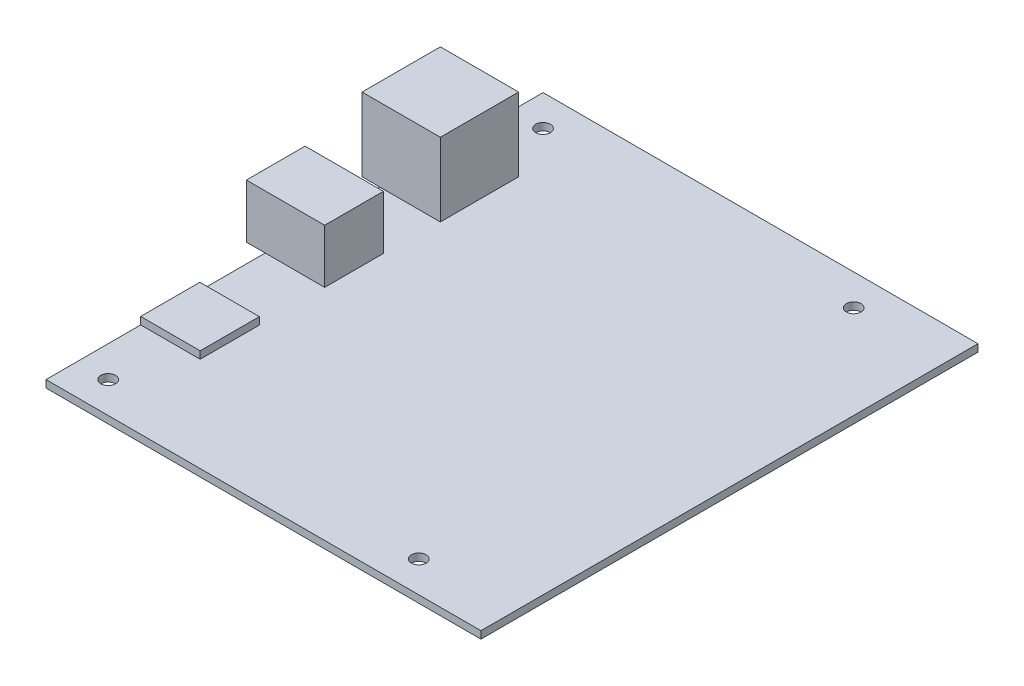
ISO-10303-21;
HEADER;
FILE_DESCRIPTION(('STEP AP214'),'2;1');
FILE_NAME('part.step','',(''),(''),'','','');
FILE_SCHEMA(('AUTOMOTIVE_DESIGN { 1 0 10303 214 1 1 1 1 }'));
ENDSEC;
DATA;
#1=APPLICATION_CONTEXT('core data for automotive mechanical design processes');
#2=APPLICATION_PROTOCOL_DEFINITION('international standard','automotive_design',2000,#1);
#3=PRODUCT_CONTEXT('',#1,'mechanical');
#4=PRODUCT('Part','Part','',(#3));
#5=PRODUCT_RELATED_PRODUCT_CATEGORY('part','',(#4));
#6=PRODUCT_DEFINITION_FORMATION('','',#4);
#7=PRODUCT_DEFINITION_CONTEXT('part definition',#1,'design');
#8=PRODUCT_DEFINITION('design','',#6,#7);
#9=PRODUCT_DEFINITION_SHAPE('','',#8);
#10=(LENGTH_UNIT() NAMED_UNIT(*) SI_UNIT(.MILLI.,.METRE.));
#11=(NAMED_UNIT(*) PLANE_ANGLE_UNIT() SI_UNIT($,.RADIAN.));
#12=(NAMED_UNIT(*) SI_UNIT($,.STERADIAN.) SOLID_ANGLE_UNIT());
#13=UNCERTAINTY_MEASURE_WITH_UNIT(LENGTH_MEASURE(1.E-05),#10,'distance_accuracy_value','');
#14=(GEOMETRIC_REPRESENTATION_CONTEXT(3) GLOBAL_UNCERTAINTY_ASSIGNED_CONTEXT((#13)) GLOBAL_UNIT_ASSIGNED_CONTEXT((#10,
#11,#12)) REPRESENTATION_CONTEXT('',''));
#15=CARTESIAN_POINT('',(0.,0.,0.));
#16=DIRECTION('',(0.,0.,1.));
#17=DIRECTION('',(1.,0.,0.));
#18=AXIS2_PLACEMENT_3D('',#15,#16,#17);
#19=CARTESIAN_POINT('',(44.45,1.5,0.));
#20=DIRECTION('',(1.,0.,0.));
#21=DIRECTION('',(0.,0.,-1.));
#22=AXIS2_PLACEMENT_3D('',#19,#20,#21);
#23=PLANE('',#22);
#24=DIRECTION('',(0.,0.,1.));
#25=VECTOR('',#24,1.);
#26=CARTESIAN_POINT('',(44.45,0.,0.));
#27=LINE('',#26,#25);
#28=CARTESIAN_POINT('',(44.45,0.,-50.8));
#29=VERTEX_POINT('',#28);
#30=CARTESIAN_POINT('',(44.45,0.,50.8));
#31=VERTEX_POINT('',#30);
#32=EDGE_CURVE('E301',#29,#31,#27,.T.);
#33=ORIENTED_EDGE('',*,*,#32,.F.);
#34=DIRECTION('',(0.,-1.,0.));
#35=VECTOR('',#34,1.);
#36=CARTESIAN_POINT('',(44.45,1.5,-50.8));
#37=LINE('',#36,#35);
#38=CARTESIAN_POINT('',(44.45,1.5,-50.8));
#39=VERTEX_POINT('',#38);
#40=EDGE_CURVE('E318',#39,#29,#37,.T.);
#41=ORIENTED_EDGE('',*,*,#40,.F.);
#42=DIRECTION('',(0.,0.,1.));
#43=VECTOR('',#42,1.);
#44=CARTESIAN_POINT('',(44.45,1.5,0.));
#45=LINE('',#44,#43);
#46=CARTESIAN_POINT('',(44.45,1.5,50.8));
#47=VERTEX_POINT('',#46);
#48=EDGE_CURVE('E276',#39,#47,#45,.T.);
#49=ORIENTED_EDGE('',*,*,#48,.T.);
#50=DIRECTION('',(0.,-1.,0.));
#51=VECTOR('',#50,1.);
#52=CARTESIAN_POINT('',(44.45,1.5,50.8));
#53=LINE('',#52,#51);
#54=EDGE_CURVE('E289',#47,#31,#53,.T.);
#55=ORIENTED_EDGE('',*,*,#54,.T.);
#56=EDGE_LOOP('',(#33,#41,#49,#55));
#57=FACE_BOUND('',#56,.T.);
#58=ADVANCED_FACE('F38',(#57),#23,.T.);
#59=CARTESIAN_POINT('',(0.,1.5,-50.8));
#60=DIRECTION('',(0.,0.,-1.));
#61=DIRECTION('',(-1.,0.,0.));
#62=AXIS2_PLACEMENT_3D('',#59,#60,#61);
#63=PLANE('',#62);
#64=DIRECTION('',(1.,0.,0.));
#65=VECTOR('',#64,1.);
#66=CARTESIAN_POINT('',(0.,0.,-50.8));
#67=LINE('',#66,#65);
#68=CARTESIAN_POINT('',(-44.45,0.,-50.8));
#69=VERTEX_POINT('',#68);
#70=EDGE_CURVE('E304',#69,#29,#67,.T.);
#71=ORIENTED_EDGE('',*,*,#70,.F.);
#72=DIRECTION('',(0.,-1.,0.));
#73=VECTOR('',#72,1.);
#74=CARTESIAN_POINT('',(-44.45,1.5,-50.8));
#75=LINE('',#74,#73);
#76=CARTESIAN_POINT('',(-44.45,1.5,-50.8));
#77=VERTEX_POINT('',#76);
#78=EDGE_CURVE('E316',#77,#69,#75,.T.);
#79=ORIENTED_EDGE('',*,*,#78,.F.);
#80=DIRECTION('',(1.,0.,0.));
#81=VECTOR('',#80,1.);
#82=CARTESIAN_POINT('',(0.,1.5,-50.8));
#83=LINE('',#82,#81);
#84=EDGE_CURVE('E279',#77,#39,#83,.T.);
#85=ORIENTED_EDGE('',*,*,#84,.T.);
#86=ORIENTED_EDGE('',*,*,#40,.T.);
#87=EDGE_LOOP('',(#71,#79,#85,#86));
#88=FACE_BOUND('',#87,.T.);
#89=ADVANCED_FACE('F361',(#88),#63,.T.);
#90=CARTESIAN_POINT('',(-44.45,1.5,0.));
#91=DIRECTION('',(1.,0.,0.));
#92=DIRECTION('',(0.,0.,-1.));
#93=AXIS2_PLACEMENT_3D('',#90,#91,#92);
#94=PLANE('',#93);
#95=DIRECTION('',(0.,0.,1.));
#96=VECTOR('',#95,1.);
#97=CARTESIAN_POINT('',(-44.45,0.,0.));
#98=LINE('',#97,#96);
#99=CARTESIAN_POINT('',(-44.45,0.,50.8));
#100=VERTEX_POINT('',#99);
#101=EDGE_CURVE('E307',#69,#100,#98,.T.);
#102=ORIENTED_EDGE('',*,*,#101,.T.);
#103=DIRECTION('',(0.,-1.,0.));
#104=VECTOR('',#103,1.);
#105=CARTESIAN_POINT('',(-44.45,1.5,50.8));
#106=LINE('',#105,#104);
#107=CARTESIAN_POINT('',(-44.45,1.5,50.8));
#108=VERTEX_POINT('',#107);
#109=EDGE_CURVE('E313',#108,#100,#106,.T.);
#110=ORIENTED_EDGE('',*,*,#109,.F.);
#111=DIRECTION('',(0.,0.,1.));
#112=VECTOR('',#111,1.);
#113=CARTESIAN_POINT('',(-44.45,1.5,0.));
#114=LINE('',#113,#112);
#115=CARTESIAN_POINT('',(-44.45,1.5,31.45));
#116=VERTEX_POINT('',#115);
#117=EDGE_CURVE('E282',#116,#108,#114,.T.);
#118=ORIENTED_EDGE('',*,*,#117,.F.);
#119=DIRECTION('',(0.,-1.,0.));
#120=VECTOR('',#119,1.);
#121=CARTESIAN_POINT('',(-44.45,3.,31.45));
#122=LINE('',#121,#120);
#123=CARTESIAN_POINT('',(-44.45,3.,31.45));
#124=VERTEX_POINT('',#123);
#125=EDGE_CURVE('E53',#124,#116,#122,.T.);
#126=ORIENTED_EDGE('',*,*,#125,.F.);
#127=DIRECTION('',(0.,0.,1.));
#128=VECTOR('',#127,1.);
#129=CARTESIAN_POINT('',(-44.45,3.,0.));
#130=LINE('',#129,#128);
#131=CARTESIAN_POINT('',(-44.45,3.,19.35));
#132=VERTEX_POINT('',#131);
#133=EDGE_CURVE('E188',#132,#124,#130,.T.);
#134=ORIENTED_EDGE('',*,*,#133,.F.);
#135=DIRECTION('',(0.,-1.,0.));
#136=VECTOR('',#135,1.);
#137=CARTESIAN_POINT('',(-44.45,3.,19.35));
#138=LINE('',#137,#136);
#139=CARTESIAN_POINT('',(-44.45,1.5,19.35));
#140=VERTEX_POINT('',#139);
#141=EDGE_CURVE('E176',#132,#140,#138,.T.);
#142=ORIENTED_EDGE('',*,*,#141,.T.);
#143=CARTESIAN_POINT('',(-44.45,1.5,5.99999999999998));
#144=VERTEX_POINT('',#143);
#145=EDGE_CURVE('E347',#144,#140,#114,.T.);
#146=ORIENTED_EDGE('',*,*,#145,.F.);
#147=CARTESIAN_POINT('',(-44.45,1.5,-6.00000000000002));
#148=VERTEX_POINT('',#147);
#149=EDGE_CURVE('E345',#148,#144,#114,.T.);
#150=ORIENTED_EDGE('',*,*,#149,.F.);
#151=CARTESIAN_POINT('',(-44.45,1.5,-17.4));
#152=VERTEX_POINT('',#151);
#153=EDGE_CURVE('E344',#152,#148,#114,.T.);
#154=ORIENTED_EDGE('',*,*,#153,.F.);
#155=CARTESIAN_POINT('',(-44.45,1.5,-33.4));
#156=VERTEX_POINT('',#155);
#157=EDGE_CURVE('E287',#156,#152,#114,.T.);
#158=ORIENTED_EDGE('',*,*,#157,.F.);
#159=EDGE_CURVE('E283',#77,#156,#114,.T.);
#160=ORIENTED_EDGE('',*,*,#159,.F.);
#161=ORIENTED_EDGE('',*,*,#78,.T.);
#162=EDGE_LOOP('',(#102,#110,#118,#126,#134,#142,#146,#150,#154,#158,#160,#161));
#163=FACE_BOUND('',#162,.T.);
#164=ADVANCED_FACE('F341',(#163),#94,.F.);
#165=CARTESIAN_POINT('',(-38.1,1.5,-44.45));
#166=DIRECTION('',(0.,-1.,0.));
#167=DIRECTION('',(0.,0.,-1.));
#168=AXIS2_PLACEMENT_3D('',#165,#166,#167);
#169=CYLINDRICAL_SURFACE('',#168,1.5);
#170=CARTESIAN_POINT('',(-38.1,1.5,-44.45));
#171=DIRECTION('',(0.,1.,0.));
#172=DIRECTION('',(0.,0.,1.));
#173=AXIS2_PLACEMENT_3D('',#170,#171,#172);
#174=CIRCLE('',#173,1.5);
#175=CARTESIAN_POINT('',(-38.1,1.5,-42.95));
#176=VERTEX_POINT('',#175);
#177=EDGE_CURVE('E273',#176,#176,#174,.T.);
#178=ORIENTED_EDGE('',*,*,#177,.T.);
#179=EDGE_LOOP('',(#178));
#180=FACE_BOUND('',#179,.T.);
#181=CARTESIAN_POINT('',(-38.1,0.,-44.45));
#182=DIRECTION('',(0.,1.,0.));
#183=DIRECTION('',(0.,0.,1.));
#184=AXIS2_PLACEMENT_3D('',#181,#182,#183);
#185=CIRCLE('',#184,1.5);
#186=CARTESIAN_POINT('',(-38.1,0.,-42.95));
#187=VERTEX_POINT('',#186);
#188=EDGE_CURVE('E298',#187,#187,#185,.T.);
#189=ORIENTED_EDGE('',*,*,#188,.F.);
#190=EDGE_LOOP('',(#189));
#191=FACE_BOUND('',#190,.T.);
#192=ADVANCED_FACE('F372',(#180,#191),#169,.F.);
#193=CARTESIAN_POINT('',(25.4,1.5,-44.45));
#194=DIRECTION('',(0.,-1.,0.));
#195=DIRECTION('',(0.,0.,-1.));
#196=AXIS2_PLACEMENT_3D('',#193,#194,#195);
#197=CYLINDRICAL_SURFACE('',#196,1.5);
#198=CARTESIAN_POINT('',(25.4,1.5,-44.45));
#199=DIRECTION('',(0.,1.,0.));
#200=DIRECTION('',(0.,0.,1.));
#201=AXIS2_PLACEMENT_3D('',#198,#199,#200);
#202=CIRCLE('',#201,1.5);
#203=CARTESIAN_POINT('',(25.4,1.5,-42.95));
#204=VERTEX_POINT('',#203);
#205=EDGE_CURVE('E270',#204,#204,#202,.T.);
#206=ORIENTED_EDGE('',*,*,#205,.T.);
#207=EDGE_LOOP('',(#206));
#208=FACE_BOUND('',#207,.T.);
#209=CARTESIAN_POINT('',(25.4,0.,-44.45));
#210=DIRECTION('',(0.,1.,0.));
#211=DIRECTION('',(0.,0.,1.));
#212=AXIS2_PLACEMENT_3D('',#209,#210,#211);
#213=CIRCLE('',#212,1.5);
#214=CARTESIAN_POINT('',(25.4,0.,-42.95));
#215=VERTEX_POINT('',#214);
#216=EDGE_CURVE('E295',#215,#215,#213,.T.);
#217=ORIENTED_EDGE('',*,*,#216,.F.);
#218=EDGE_LOOP('',(#217));
#219=FACE_BOUND('',#218,.T.);
#220=ADVANCED_FACE('F375',(#208,#219),#197,.F.);
#221=CARTESIAN_POINT('',(-38.1,1.5,44.45));
#222=DIRECTION('',(0.,-1.,0.));
#223=DIRECTION('',(0.,0.,-1.));
#224=AXIS2_PLACEMENT_3D('',#221,#222,#223);
#225=CYLINDRICAL_SURFACE('',#224,1.5);
#226=CARTESIAN_POINT('',(-38.1,1.5,44.45));
#227=DIRECTION('',(0.,1.,0.));
#228=DIRECTION('',(0.,0.,1.));
#229=AXIS2_PLACEMENT_3D('',#226,#227,#228);
#230=CIRCLE('',#229,1.5);
#231=CARTESIAN_POINT('',(-38.1,1.5,45.95));
#232=VERTEX_POINT('',#231);
#233=EDGE_CURVE('E266',#232,#232,#230,.T.);
#234=ORIENTED_EDGE('',*,*,#233,.T.);
#235=EDGE_LOOP('',(#234));
#236=FACE_BOUND('',#235,.T.);
#237=CARTESIAN_POINT('',(-38.1,0.,44.45));
#238=DIRECTION('',(0.,1.,0.));
#239=DIRECTION('',(0.,0.,1.));
#240=AXIS2_PLACEMENT_3D('',#237,#238,#239);
#241=CIRCLE('',#240,1.5);
#242=CARTESIAN_POINT('',(-38.1,0.,45.95));
#243=VERTEX_POINT('',#242);
#244=EDGE_CURVE('E292',#243,#243,#241,.T.);
#245=ORIENTED_EDGE('',*,*,#244,.F.);
#246=EDGE_LOOP('',(#245));
#247=FACE_BOUND('',#246,.T.);
#248=ADVANCED_FACE('F378',(#236,#247),#225,.F.);
#249=CARTESIAN_POINT('',(25.4,1.5,44.45));
#250=DIRECTION('',(0.,-1.,0.));
#251=DIRECTION('',(0.,0.,-1.));
#252=AXIS2_PLACEMENT_3D('',#249,#250,#251);
#253=CYLINDRICAL_SURFACE('',#252,1.5);
#254=CARTESIAN_POINT('',(25.4,1.5,44.45));
#255=DIRECTION('',(0.,1.,0.));
#256=DIRECTION('',(0.,0.,1.));
#257=AXIS2_PLACEMENT_3D('',#254,#255,#256);
#258=CIRCLE('',#257,1.5);
#259=CARTESIAN_POINT('',(25.4,1.5,45.95));
#260=VERTEX_POINT('',#259);
#261=EDGE_CURVE('E263',#260,#260,#258,.T.);
#262=ORIENTED_EDGE('',*,*,#261,.T.);
#263=EDGE_LOOP('',(#262));
#264=FACE_BOUND('',#263,.T.);
#265=CARTESIAN_POINT('',(25.4,0.,44.45));
#266=DIRECTION('',(0.,1.,0.));
#267=DIRECTION('',(0.,0.,1.));
#268=AXIS2_PLACEMENT_3D('',#265,#266,#267);
#269=CIRCLE('',#268,1.5);
#270=CARTESIAN_POINT('',(25.4,0.,45.95));
#271=VERTEX_POINT('',#270);
#272=EDGE_CURVE('E262',#271,#271,#269,.T.);
#273=ORIENTED_EDGE('',*,*,#272,.F.);
#274=EDGE_LOOP('',(#273));
#275=FACE_BOUND('',#274,.T.);
#276=ADVANCED_FACE('F40',(#264,#275),#253,.F.);
#277=CARTESIAN_POINT('',(0.,1.5,50.8));
#278=DIRECTION('',(0.,0.,-1.));
#279=DIRECTION('',(-1.,0.,0.));
#280=AXIS2_PLACEMENT_3D('',#277,#278,#279);
#281=PLANE('',#280);
#282=DIRECTION('',(1.,0.,0.));
#283=VECTOR('',#282,1.);
#284=CARTESIAN_POINT('',(0.,0.,50.8));
#285=LINE('',#284,#283);
#286=EDGE_CURVE('E267',#100,#31,#285,.T.);
#287=ORIENTED_EDGE('',*,*,#286,.T.);
#288=ORIENTED_EDGE('',*,*,#54,.F.);
#289=DIRECTION('',(1.,0.,0.));
#290=VECTOR('',#289,1.);
#291=CARTESIAN_POINT('',(0.,1.5,50.8));
#292=LINE('',#291,#290);
#293=EDGE_CURVE('E286',#108,#47,#292,.T.);
#294=ORIENTED_EDGE('',*,*,#293,.F.);
#295=ORIENTED_EDGE('',*,*,#109,.T.);
#296=EDGE_LOOP('',(#287,#288,#294,#295));
#297=FACE_BOUND('',#296,.T.);
#298=ADVANCED_FACE('F355',(#297),#281,.F.);
#299=CARTESIAN_POINT('',(0.,1.5,0.));
#300=DIRECTION('',(0.,1.,0.));
#301=DIRECTION('',(0.,0.,1.));
#302=AXIS2_PLACEMENT_3D('',#299,#300,#301);
#303=PLANE('',#302);
#304=DIRECTION('',(1.,0.,0.));
#305=VECTOR('',#304,1.);
#306=CARTESIAN_POINT('',(0.,1.5,19.35));
#307=LINE('',#306,#305);
#308=CARTESIAN_POINT('',(-32.29,1.5,19.35));
#309=VERTEX_POINT('',#308);
#310=EDGE_CURVE('E195',#140,#309,#307,.T.);
#311=ORIENTED_EDGE('',*,*,#310,.T.);
#312=DIRECTION('',(0.,0.,1.));
#313=VECTOR('',#312,1.);
#314=CARTESIAN_POINT('',(-32.29,1.5,0.));
#315=LINE('',#314,#313);
#316=CARTESIAN_POINT('',(-32.29,1.5,31.45));
#317=VERTEX_POINT('',#316);
#318=EDGE_CURVE('E170',#309,#317,#315,.T.);
#319=ORIENTED_EDGE('',*,*,#318,.T.);
#320=DIRECTION('',(1.,0.,0.));
#321=VECTOR('',#320,1.);
#322=CARTESIAN_POINT('',(0.,1.5,31.45));
#323=LINE('',#322,#321);
#324=EDGE_CURVE('E184',#116,#317,#323,.T.);
#325=ORIENTED_EDGE('',*,*,#324,.F.);
#326=ORIENTED_EDGE('',*,*,#117,.T.);
#327=ORIENTED_EDGE('',*,*,#293,.T.);
#328=ORIENTED_EDGE('',*,*,#48,.F.);
#329=ORIENTED_EDGE('',*,*,#84,.F.);
#330=ORIENTED_EDGE('',*,*,#159,.T.);
#331=DIRECTION('',(1.,0.,0.));
#332=VECTOR('',#331,1.);
#333=CARTESIAN_POINT('',(0.,1.5,-33.4));
#334=LINE('',#333,#332);
#335=CARTESIAN_POINT('',(-32.044,1.5,-33.4));
#336=VERTEX_POINT('',#335);
#337=EDGE_CURVE('E247',#156,#336,#334,.T.);
#338=ORIENTED_EDGE('',*,*,#337,.T.);
#339=DIRECTION('',(0.,0.,1.));
#340=VECTOR('',#339,1.);
#341=CARTESIAN_POINT('',(-32.044,1.5,0.));
#342=LINE('',#341,#340);
#343=CARTESIAN_POINT('',(-32.044,1.5,-17.4));
#344=VERTEX_POINT('',#343);
#345=EDGE_CURVE('E228',#336,#344,#342,.T.);
#346=ORIENTED_EDGE('',*,*,#345,.T.);
#347=DIRECTION('',(1.,0.,0.));
#348=VECTOR('',#347,1.);
#349=CARTESIAN_POINT('',(0.,1.5,-17.4));
#350=LINE('',#349,#348);
#351=EDGE_CURVE('E251',#152,#344,#350,.T.);
#352=ORIENTED_EDGE('',*,*,#351,.F.);
#353=ORIENTED_EDGE('',*,*,#153,.T.);
#354=DIRECTION('',(-1.,0.,0.));
#355=VECTOR('',#354,1.);
#356=CARTESIAN_POINT('',(0.,1.5,-6.00000000000004));
#357=LINE('',#356,#355);
#358=CARTESIAN_POINT('',(-32.29,1.5,-6.00000000000002));
#359=VERTEX_POINT('',#358);
#360=EDGE_CURVE('E11',#359,#148,#357,.T.);
#361=ORIENTED_EDGE('',*,*,#360,.F.);
#362=DIRECTION('',(0.,0.,1.));
#363=VECTOR('',#362,1.);
#364=CARTESIAN_POINT('',(-32.29,1.5,0.));
#365=LINE('',#364,#363);
#366=CARTESIAN_POINT('',(-32.29,1.5,5.99999999999998));
#367=VERTEX_POINT('',#366);
#368=EDGE_CURVE('E175',#359,#367,#365,.T.);
#369=ORIENTED_EDGE('',*,*,#368,.T.);
#370=DIRECTION('',(-1.,0.,0.));
#371=VECTOR('',#370,1.);
#372=CARTESIAN_POINT('',(0.,1.5,5.99999999999999));
#373=LINE('',#372,#371);
#374=EDGE_CURVE('E46',#367,#144,#373,.T.);
#375=ORIENTED_EDGE('',*,*,#374,.T.);
#376=ORIENTED_EDGE('',*,*,#145,.T.);
#377=EDGE_LOOP('',(#311,#319,#325,#326,#327,#328,#329,#330,#338,#346,#352,#353,#361,#369,#375,#376));
#378=FACE_BOUND('',#377,.T.);
#379=ORIENTED_EDGE('',*,*,#261,.F.);
#380=EDGE_LOOP('',(#379));
#381=FACE_BOUND('',#380,.T.);
#382=ORIENTED_EDGE('',*,*,#233,.F.);
#383=EDGE_LOOP('',(#382));
#384=FACE_BOUND('',#383,.T.);
#385=ORIENTED_EDGE('',*,*,#205,.F.);
#386=EDGE_LOOP('',(#385));
#387=FACE_BOUND('',#386,.T.);
#388=ORIENTED_EDGE('',*,*,#177,.F.);
#389=EDGE_LOOP('',(#388));
#390=FACE_BOUND('',#389,.T.);
#391=ADVANCED_FACE('F327',(#378,#381,#384,#387,#390),#303,.T.);
#392=CARTESIAN_POINT('',(0.,0.,0.));
#393=DIRECTION('',(0.,1.,0.));
#394=DIRECTION('',(0.,0.,1.));
#395=AXIS2_PLACEMENT_3D('',#392,#393,#394);
#396=PLANE('',#395);
#397=ORIENTED_EDGE('',*,*,#272,.T.);
#398=EDGE_LOOP('',(#397));
#399=FACE_BOUND('',#398,.T.);
#400=ORIENTED_EDGE('',*,*,#244,.T.);
#401=EDGE_LOOP('',(#400));
#402=FACE_BOUND('',#401,.T.);
#403=ORIENTED_EDGE('',*,*,#216,.T.);
#404=EDGE_LOOP('',(#403));
#405=FACE_BOUND('',#404,.T.);
#406=ORIENTED_EDGE('',*,*,#188,.T.);
#407=EDGE_LOOP('',(#406));
#408=FACE_BOUND('',#407,.T.);
#409=ORIENTED_EDGE('',*,*,#32,.T.);
#410=ORIENTED_EDGE('',*,*,#286,.F.);
#411=ORIENTED_EDGE('',*,*,#101,.F.);
#412=ORIENTED_EDGE('',*,*,#70,.T.);
#413=EDGE_LOOP('',(#409,#410,#411,#412));
#414=FACE_BOUND('',#413,.T.);
#415=ADVANCED_FACE('F359',(#399,#402,#405,#408,#414),#396,.F.);
#416=CARTESIAN_POINT('',(0.,1.5,0.));
#417=DIRECTION('',(0.,1.,0.));
#418=DIRECTION('',(0.,0.,1.));
#419=AXIS2_PLACEMENT_3D('',#416,#417,#418);
#420=PLANE('',#419);
#421=CARTESIAN_POINT('',(-48.044,1.5,-33.4));
#422=VERTEX_POINT('',#421);
#423=EDGE_CURVE('E243',#422,#156,#334,.T.);
#424=ORIENTED_EDGE('',*,*,#423,.T.);
#425=ORIENTED_EDGE('',*,*,#157,.T.);
#426=CARTESIAN_POINT('',(-48.044,1.5,-17.4));
#427=VERTEX_POINT('',#426);
#428=EDGE_CURVE('E233',#427,#152,#350,.T.);
#429=ORIENTED_EDGE('',*,*,#428,.F.);
#430=DIRECTION('',(0.,0.,1.));
#431=VECTOR('',#430,1.);
#432=CARTESIAN_POINT('',(-48.044,1.5,0.));
#433=LINE('',#432,#431);
#434=EDGE_CURVE('E246',#422,#427,#433,.T.);
#435=ORIENTED_EDGE('',*,*,#434,.F.);
#436=EDGE_LOOP('',(#424,#425,#429,#435));
#437=FACE_BOUND('',#436,.T.);
#438=ADVANCED_FACE('F337',(#437),#420,.F.);
#439=CARTESIAN_POINT('',(-32.044,16.5,0.));
#440=DIRECTION('',(1.,0.,0.));
#441=DIRECTION('',(0.,0.,-1.));
#442=AXIS2_PLACEMENT_3D('',#439,#440,#441);
#443=PLANE('',#442);
#444=ORIENTED_EDGE('',*,*,#345,.F.);
#445=DIRECTION('',(0.,-1.,0.));
#446=VECTOR('',#445,1.);
#447=CARTESIAN_POINT('',(-32.044,16.5,-33.4));
#448=LINE('',#447,#446);
#449=CARTESIAN_POINT('',(-32.044,16.5,-33.4));
#450=VERTEX_POINT('',#449);
#451=EDGE_CURVE('E259',#450,#336,#448,.T.);
#452=ORIENTED_EDGE('',*,*,#451,.F.);
#453=DIRECTION('',(0.,0.,1.));
#454=VECTOR('',#453,1.);
#455=CARTESIAN_POINT('',(-32.044,16.5,0.));
#456=LINE('',#455,#454);
#457=CARTESIAN_POINT('',(-32.044,16.5,-17.4));
#458=VERTEX_POINT('',#457);
#459=EDGE_CURVE('E229',#450,#458,#456,.T.);
#460=ORIENTED_EDGE('',*,*,#459,.T.);
#461=DIRECTION('',(0.,-1.,0.));
#462=VECTOR('',#461,1.);
#463=CARTESIAN_POINT('',(-32.044,16.5,-17.4));
#464=LINE('',#463,#462);
#465=EDGE_CURVE('E240',#458,#344,#464,.T.);
#466=ORIENTED_EDGE('',*,*,#465,.T.);
#467=EDGE_LOOP('',(#444,#452,#460,#466));
#468=FACE_BOUND('',#467,.T.);
#469=ADVANCED_FACE('F403',(#468),#443,.T.);
#470=CARTESIAN_POINT('',(0.,16.5,-33.4));
#471=DIRECTION('',(0.,0.,-1.));
#472=DIRECTION('',(-1.,0.,0.));
#473=AXIS2_PLACEMENT_3D('',#470,#471,#472);
#474=PLANE('',#473);
#475=ORIENTED_EDGE('',*,*,#423,.F.);
#476=DIRECTION('',(0.,-1.,0.));
#477=VECTOR('',#476,1.);
#478=CARTESIAN_POINT('',(-48.044,16.5,-33.4));
#479=LINE('',#478,#477);
#480=CARTESIAN_POINT('',(-48.044,16.5,-33.4));
#481=VERTEX_POINT('',#480);
#482=EDGE_CURVE('E257',#481,#422,#479,.T.);
#483=ORIENTED_EDGE('',*,*,#482,.F.);
#484=DIRECTION('',(1.,0.,0.));
#485=VECTOR('',#484,1.);
#486=CARTESIAN_POINT('',(0.,16.5,-33.4));
#487=LINE('',#486,#485);
#488=EDGE_CURVE('E232',#481,#450,#487,.T.);
#489=ORIENTED_EDGE('',*,*,#488,.T.);
#490=ORIENTED_EDGE('',*,*,#451,.T.);
#491=ORIENTED_EDGE('',*,*,#337,.F.);
#492=EDGE_LOOP('',(#475,#483,#489,#490,#491));
#493=FACE_BOUND('',#492,.T.);
#494=ADVANCED_FACE('F333',(#493),#474,.T.);
#495=CARTESIAN_POINT('',(-48.044,16.5,0.));
#496=DIRECTION('',(1.,0.,0.));
#497=DIRECTION('',(0.,0.,-1.));
#498=AXIS2_PLACEMENT_3D('',#495,#496,#497);
#499=PLANE('',#498);
#500=ORIENTED_EDGE('',*,*,#434,.T.);
#501=DIRECTION('',(0.,-1.,0.));
#502=VECTOR('',#501,1.);
#503=CARTESIAN_POINT('',(-48.044,16.5,-17.4));
#504=LINE('',#503,#502);
#505=CARTESIAN_POINT('',(-48.044,16.5,-17.4));
#506=VERTEX_POINT('',#505);
#507=EDGE_CURVE('E254',#506,#427,#504,.T.);
#508=ORIENTED_EDGE('',*,*,#507,.F.);
#509=DIRECTION('',(0.,0.,1.));
#510=VECTOR('',#509,1.);
#511=CARTESIAN_POINT('',(-48.044,16.5,0.));
#512=LINE('',#511,#510);
#513=EDGE_CURVE('E236',#481,#506,#512,.T.);
#514=ORIENTED_EDGE('',*,*,#513,.F.);
#515=ORIENTED_EDGE('',*,*,#482,.T.);
#516=EDGE_LOOP('',(#500,#508,#514,#515));
#517=FACE_BOUND('',#516,.T.);
#518=ADVANCED_FACE('F469',(#517),#499,.F.);
#519=CARTESIAN_POINT('',(0.,16.5,-17.4));
#520=DIRECTION('',(0.,0.,-1.));
#521=DIRECTION('',(-1.,0.,0.));
#522=AXIS2_PLACEMENT_3D('',#519,#520,#521);
#523=PLANE('',#522);
#524=ORIENTED_EDGE('',*,*,#428,.T.);
#525=ORIENTED_EDGE('',*,*,#351,.T.);
#526=ORIENTED_EDGE('',*,*,#465,.F.);
#527=DIRECTION('',(1.,0.,0.));
#528=VECTOR('',#527,1.);
#529=CARTESIAN_POINT('',(0.,16.5,-17.4));
#530=LINE('',#529,#528);
#531=EDGE_CURVE('E238',#506,#458,#530,.T.);
#532=ORIENTED_EDGE('',*,*,#531,.F.);
#533=ORIENTED_EDGE('',*,*,#507,.T.);
#534=EDGE_LOOP('',(#524,#525,#526,#532,#533));
#535=FACE_BOUND('',#534,.T.);
#536=ADVANCED_FACE('F478',(#535),#523,.F.);
#537=CARTESIAN_POINT('',(0.,16.5,0.));
#538=DIRECTION('',(0.,1.,0.));
#539=DIRECTION('',(0.,0.,1.));
#540=AXIS2_PLACEMENT_3D('',#537,#538,#539);
#541=PLANE('',#540);
#542=ORIENTED_EDGE('',*,*,#459,.F.);
#543=ORIENTED_EDGE('',*,*,#488,.F.);
#544=ORIENTED_EDGE('',*,*,#513,.T.);
#545=ORIENTED_EDGE('',*,*,#531,.T.);
#546=EDGE_LOOP('',(#542,#543,#544,#545));
#547=FACE_BOUND('',#546,.T.);
#548=ADVANCED_FACE('F488',(#547),#541,.T.);
#549=CARTESIAN_POINT('',(0.,1.5,0.));
#550=DIRECTION('',(0.,1.,0.));
#551=DIRECTION('',(0.,0.,1.));
#552=AXIS2_PLACEMENT_3D('',#549,#550,#551);
#553=PLANE('',#552);
#554=DIRECTION('',(1.,0.,0.));
#555=VECTOR('',#554,1.);
#556=CARTESIAN_POINT('',(0.,1.5,-6.00000000000004));
#557=LINE('',#556,#555);
#558=CARTESIAN_POINT('',(-48.29,1.5,-6.00000000000001));
#559=VERTEX_POINT('',#558);
#560=EDGE_CURVE('E214',#559,#148,#557,.T.);
#561=ORIENTED_EDGE('',*,*,#560,.T.);
#562=ORIENTED_EDGE('',*,*,#149,.T.);
#563=DIRECTION('',(1.,0.,0.));
#564=VECTOR('',#563,1.);
#565=CARTESIAN_POINT('',(0.,1.5,5.99999999999999));
#566=LINE('',#565,#564);
#567=CARTESIAN_POINT('',(-48.29,1.5,5.99999999999997));
#568=VERTEX_POINT('',#567);
#569=EDGE_CURVE('E61',#568,#144,#566,.T.);
#570=ORIENTED_EDGE('',*,*,#569,.F.);
#571=DIRECTION('',(0.,0.,1.));
#572=VECTOR('',#571,1.);
#573=CARTESIAN_POINT('',(-48.29,1.5,0.));
#574=LINE('',#573,#572);
#575=EDGE_CURVE('E217',#559,#568,#574,.T.);
#576=ORIENTED_EDGE('',*,*,#575,.F.);
#577=EDGE_LOOP('',(#561,#562,#570,#576));
#578=FACE_BOUND('',#577,.T.);
#579=ADVANCED_FACE('F498',(#578),#553,.F.);
#580=CARTESIAN_POINT('',(-32.29,12.5,0.));
#581=DIRECTION('',(1.,0.,0.));
#582=DIRECTION('',(0.,0.,-1.));
#583=AXIS2_PLACEMENT_3D('',#580,#581,#582);
#584=PLANE('',#583);
#585=ORIENTED_EDGE('',*,*,#368,.F.);
#586=DIRECTION('',(0.,-1.,0.));
#587=VECTOR('',#586,1.);
#588=CARTESIAN_POINT('',(-32.29,12.5,-6.00000000000002));
#589=LINE('',#588,#587);
#590=CARTESIAN_POINT('',(-32.29,12.5,-6.00000000000002));
#591=VERTEX_POINT('',#590);
#592=EDGE_CURVE('E226',#591,#359,#589,.T.);
#593=ORIENTED_EDGE('',*,*,#592,.F.);
#594=DIRECTION('',(0.,0.,1.));
#595=VECTOR('',#594,1.);
#596=CARTESIAN_POINT('',(-32.29,12.5,0.));
#597=LINE('',#596,#595);
#598=CARTESIAN_POINT('',(-32.29,12.5,5.99999999999998));
#599=VERTEX_POINT('',#598);
#600=EDGE_CURVE('E201',#591,#599,#597,.T.);
#601=ORIENTED_EDGE('',*,*,#600,.T.);
#602=DIRECTION('',(0.,-1.,0.));
#603=VECTOR('',#602,1.);
#604=CARTESIAN_POINT('',(-32.29,12.5,5.99999999999998));
#605=LINE('',#604,#603);
#606=EDGE_CURVE('E211',#599,#367,#605,.T.);
#607=ORIENTED_EDGE('',*,*,#606,.T.);
#608=EDGE_LOOP('',(#585,#593,#601,#607));
#609=FACE_BOUND('',#608,.T.);
#610=ADVANCED_FACE('F509',(#609),#584,.T.);
#611=CARTESIAN_POINT('',(0.,12.5,-6.00000000000004));
#612=DIRECTION('',(0.,0.,-1.));
#613=DIRECTION('',(-1.,0.,0.));
#614=AXIS2_PLACEMENT_3D('',#611,#612,#613);
#615=PLANE('',#614);
#616=ORIENTED_EDGE('',*,*,#560,.F.);
#617=DIRECTION('',(0.,-1.,0.));
#618=VECTOR('',#617,1.);
#619=CARTESIAN_POINT('',(-48.29,12.5,-6.00000000000001));
#620=LINE('',#619,#618);
#621=CARTESIAN_POINT('',(-48.29,12.5,-6.00000000000001));
#622=VERTEX_POINT('',#621);
#623=EDGE_CURVE('E224',#622,#559,#620,.T.);
#624=ORIENTED_EDGE('',*,*,#623,.F.);
#625=DIRECTION('',(1.,0.,0.));
#626=VECTOR('',#625,1.);
#627=CARTESIAN_POINT('',(0.,12.5,-6.00000000000004));
#628=LINE('',#627,#626);
#629=EDGE_CURVE('E204',#622,#591,#628,.T.);
#630=ORIENTED_EDGE('',*,*,#629,.T.);
#631=ORIENTED_EDGE('',*,*,#592,.T.);
#632=ORIENTED_EDGE('',*,*,#360,.T.);
#633=EDGE_LOOP('',(#616,#624,#630,#631,#632));
#634=FACE_BOUND('',#633,.T.);
#635=ADVANCED_FACE('F518',(#634),#615,.T.);
#636=CARTESIAN_POINT('',(-48.29,12.5,0.));
#637=DIRECTION('',(1.,0.,0.));
#638=DIRECTION('',(0.,0.,-1.));
#639=AXIS2_PLACEMENT_3D('',#636,#637,#638);
#640=PLANE('',#639);
#641=ORIENTED_EDGE('',*,*,#575,.T.);
#642=DIRECTION('',(0.,-1.,0.));
#643=VECTOR('',#642,1.);
#644=CARTESIAN_POINT('',(-48.29,12.5,5.99999999999997));
#645=LINE('',#644,#643);
#646=CARTESIAN_POINT('',(-48.29,12.5,5.99999999999997));
#647=VERTEX_POINT('',#646);
#648=EDGE_CURVE('E222',#647,#568,#645,.T.);
#649=ORIENTED_EDGE('',*,*,#648,.F.);
#650=DIRECTION('',(0.,0.,1.));
#651=VECTOR('',#650,1.);
#652=CARTESIAN_POINT('',(-48.29,12.5,0.));
#653=LINE('',#652,#651);
#654=EDGE_CURVE('E207',#622,#647,#653,.T.);
#655=ORIENTED_EDGE('',*,*,#654,.F.);
#656=ORIENTED_EDGE('',*,*,#623,.T.);
#657=EDGE_LOOP('',(#641,#649,#655,#656));
#658=FACE_BOUND('',#657,.T.);
#659=ADVANCED_FACE('F528',(#658),#640,.F.);
#660=CARTESIAN_POINT('',(0.,12.5,5.99999999999999));
#661=DIRECTION('',(0.,0.,-1.));
#662=DIRECTION('',(-1.,0.,0.));
#663=AXIS2_PLACEMENT_3D('',#660,#661,#662);
#664=PLANE('',#663);
#665=ORIENTED_EDGE('',*,*,#569,.T.);
#666=ORIENTED_EDGE('',*,*,#374,.F.);
#667=ORIENTED_EDGE('',*,*,#606,.F.);
#668=DIRECTION('',(1.,0.,0.));
#669=VECTOR('',#668,1.);
#670=CARTESIAN_POINT('',(0.,12.5,5.99999999999999));
#671=LINE('',#670,#669);
#672=EDGE_CURVE('E209',#647,#599,#671,.T.);
#673=ORIENTED_EDGE('',*,*,#672,.F.);
#674=ORIENTED_EDGE('',*,*,#648,.T.);
#675=EDGE_LOOP('',(#665,#666,#667,#673,#674));
#676=FACE_BOUND('',#675,.T.);
#677=ADVANCED_FACE('F538',(#676),#664,.F.);
#678=CARTESIAN_POINT('',(0.,12.5,0.));
#679=DIRECTION('',(0.,1.,0.));
#680=DIRECTION('',(0.,0.,1.));
#681=AXIS2_PLACEMENT_3D('',#678,#679,#680);
#682=PLANE('',#681);
#683=ORIENTED_EDGE('',*,*,#600,.F.);
#684=ORIENTED_EDGE('',*,*,#629,.F.);
#685=ORIENTED_EDGE('',*,*,#654,.T.);
#686=ORIENTED_EDGE('',*,*,#672,.T.);
#687=EDGE_LOOP('',(#683,#684,#685,#686));
#688=FACE_BOUND('',#687,.T.);
#689=ADVANCED_FACE('F547',(#688),#682,.T.);
#690=CARTESIAN_POINT('',(-32.29,3.,0.));
#691=DIRECTION('',(1.,0.,0.));
#692=DIRECTION('',(0.,0.,-1.));
#693=AXIS2_PLACEMENT_3D('',#690,#691,#692);
#694=PLANE('',#693);
#695=ORIENTED_EDGE('',*,*,#318,.F.);
#696=DIRECTION('',(0.,-1.,0.));
#697=VECTOR('',#696,1.);
#698=CARTESIAN_POINT('',(-32.29,3.,19.35));
#699=LINE('',#698,#697);
#700=CARTESIAN_POINT('',(-32.29,3.,19.35));
#701=VERTEX_POINT('',#700);
#702=EDGE_CURVE('E165',#701,#309,#699,.T.);
#703=ORIENTED_EDGE('',*,*,#702,.F.);
#704=DIRECTION('',(0.,0.,1.));
#705=VECTOR('',#704,1.);
#706=CARTESIAN_POINT('',(-32.29,3.,0.));
#707=LINE('',#706,#705);
#708=CARTESIAN_POINT('',(-32.29,3.,31.45));
#709=VERTEX_POINT('',#708);
#710=EDGE_CURVE('E168',#701,#709,#707,.T.);
#711=ORIENTED_EDGE('',*,*,#710,.T.);
#712=DIRECTION('',(0.,-1.,0.));
#713=VECTOR('',#712,1.);
#714=CARTESIAN_POINT('',(-32.29,3.,31.45));
#715=LINE('',#714,#713);
#716=EDGE_CURVE('E193',#709,#317,#715,.T.);
#717=ORIENTED_EDGE('',*,*,#716,.T.);
#718=EDGE_LOOP('',(#695,#703,#711,#717));
#719=FACE_BOUND('',#718,.T.);
#720=ADVANCED_FACE('F167',(#719),#694,.T.);
#721=CARTESIAN_POINT('',(0.,3.,19.35));
#722=DIRECTION('',(0.,0.,-1.));
#723=DIRECTION('',(-1.,0.,0.));
#724=AXIS2_PLACEMENT_3D('',#721,#722,#723);
#725=PLANE('',#724);
#726=ORIENTED_EDGE('',*,*,#310,.F.);
#727=ORIENTED_EDGE('',*,*,#141,.F.);
#728=DIRECTION('',(1.,0.,0.));
#729=VECTOR('',#728,1.);
#730=CARTESIAN_POINT('',(0.,3.,19.35));
#731=LINE('',#730,#729);
#732=EDGE_CURVE('E181',#132,#701,#731,.T.);
#733=ORIENTED_EDGE('',*,*,#732,.T.);
#734=ORIENTED_EDGE('',*,*,#702,.T.);
#735=EDGE_LOOP('',(#726,#727,#733,#734));
#736=FACE_BOUND('',#735,.T.);
#737=ADVANCED_FACE('F186',(#736),#725,.T.);
#738=CARTESIAN_POINT('',(0.,3.,31.45));
#739=DIRECTION('',(0.,0.,-1.));
#740=DIRECTION('',(-1.,0.,0.));
#741=AXIS2_PLACEMENT_3D('',#738,#739,#740);
#742=PLANE('',#741);
#743=ORIENTED_EDGE('',*,*,#324,.T.);
#744=ORIENTED_EDGE('',*,*,#716,.F.);
#745=DIRECTION('',(1.,0.,0.));
#746=VECTOR('',#745,1.);
#747=CARTESIAN_POINT('',(0.,3.,31.45));
#748=LINE('',#747,#746);
#749=EDGE_CURVE('E182',#124,#709,#748,.T.);
#750=ORIENTED_EDGE('',*,*,#749,.F.);
#751=ORIENTED_EDGE('',*,*,#125,.T.);
#752=EDGE_LOOP('',(#743,#744,#750,#751));
#753=FACE_BOUND('',#752,.T.);
#754=ADVANCED_FACE('F572',(#753),#742,.F.);
#755=CARTESIAN_POINT('',(0.,3.,0.));
#756=DIRECTION('',(0.,1.,0.));
#757=DIRECTION('',(0.,0.,1.));
#758=AXIS2_PLACEMENT_3D('',#755,#756,#757);
#759=PLANE('',#758);
#760=ORIENTED_EDGE('',*,*,#710,.F.);
#761=ORIENTED_EDGE('',*,*,#732,.F.);
#762=ORIENTED_EDGE('',*,*,#133,.T.);
#763=ORIENTED_EDGE('',*,*,#749,.T.);
#764=EDGE_LOOP('',(#760,#761,#762,#763));
#765=FACE_BOUND('',#764,.T.);
#766=ADVANCED_FACE('F180',(#765),#759,.T.);
#767=CLOSED_SHELL('',(#58,#89,#164,#192,#220,#248,#276,#298,#391,#415,#438,#469,#494,#518,#536,
#548,#579,#610,#635,#659,#677,#689,#720,#737,#754,#766));
#768=MANIFOLD_SOLID_BREP('B2',#767);
#769=ADVANCED_BREP_SHAPE_REPRESENTATION('',(#18,#768),#14);
#770=SHAPE_DEFINITION_REPRESENTATION(#9,#769);
ENDSEC;
END-ISO-10303-21;
